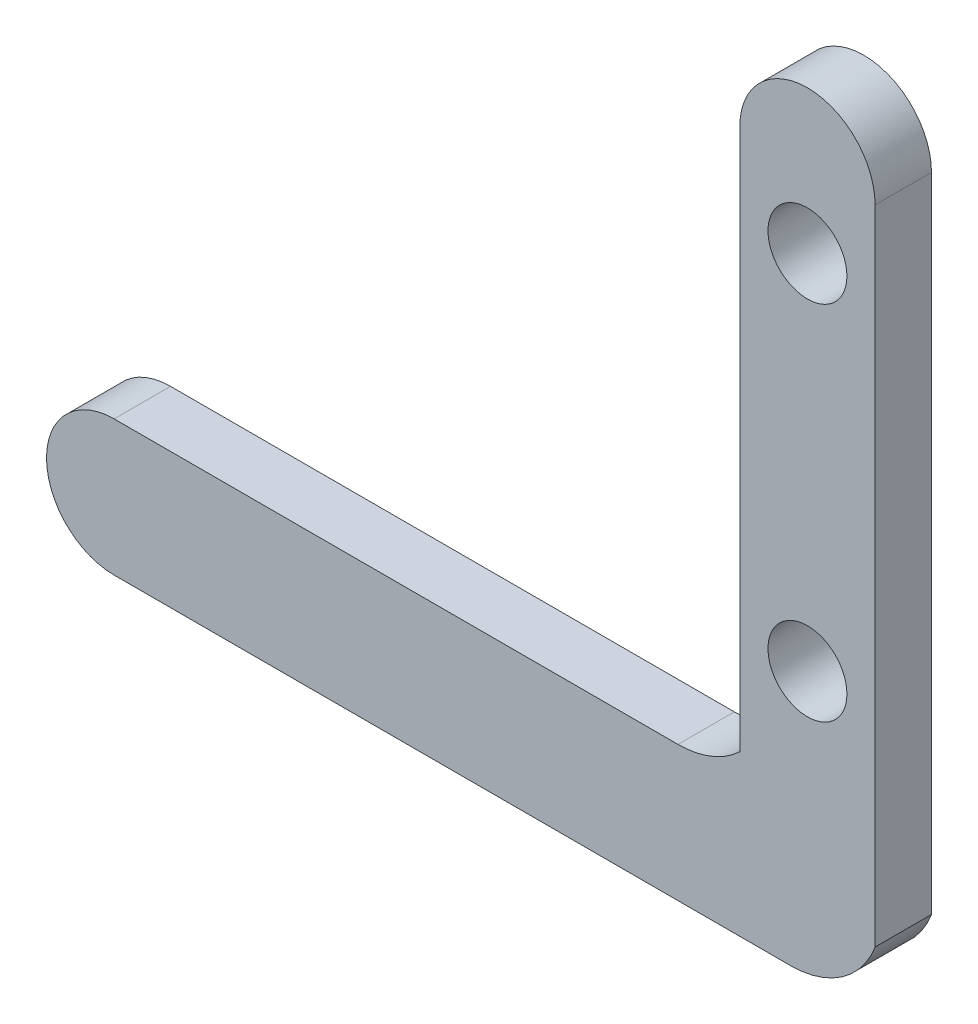
ISO-10303-21;
HEADER;
FILE_DESCRIPTION(('STEP AP214'),'2;1');
FILE_NAME('part.step','',(''),(''),'','','');
FILE_SCHEMA(('AUTOMOTIVE_DESIGN { 1 0 10303 214 1 1 1 1 }'));
ENDSEC;
DATA;
#1=APPLICATION_CONTEXT('core data for automotive mechanical design processes');
#2=APPLICATION_PROTOCOL_DEFINITION('international standard','automotive_design',2000,#1);
#3=PRODUCT_CONTEXT('',#1,'mechanical');
#4=PRODUCT('Part','Part','',(#3));
#5=PRODUCT_RELATED_PRODUCT_CATEGORY('part','',(#4));
#6=PRODUCT_DEFINITION_FORMATION('','',#4);
#7=PRODUCT_DEFINITION_CONTEXT('part definition',#1,'design');
#8=PRODUCT_DEFINITION('design','',#6,#7);
#9=PRODUCT_DEFINITION_SHAPE('','',#8);
#10=(LENGTH_UNIT() NAMED_UNIT(*) SI_UNIT(.MILLI.,.METRE.));
#11=(NAMED_UNIT(*) PLANE_ANGLE_UNIT() SI_UNIT($,.RADIAN.));
#12=(NAMED_UNIT(*) SI_UNIT($,.STERADIAN.) SOLID_ANGLE_UNIT());
#13=UNCERTAINTY_MEASURE_WITH_UNIT(LENGTH_MEASURE(1.E-05),#10,'distance_accuracy_value','');
#14=(GEOMETRIC_REPRESENTATION_CONTEXT(3) GLOBAL_UNCERTAINTY_ASSIGNED_CONTEXT((#13)) GLOBAL_UNIT_ASSIGNED_CONTEXT((#10,
#11,#12)) REPRESENTATION_CONTEXT('',''));
#15=CARTESIAN_POINT('',(0.,0.,0.));
#16=DIRECTION('',(0.,0.,1.));
#17=DIRECTION('',(1.,0.,0.));
#18=AXIS2_PLACEMENT_3D('',#15,#16,#17);
#19=CARTESIAN_POINT('',(-38.4105463641228,6.,5.));
#20=DIRECTION('',(0.,0.,-1.));
#21=DIRECTION('',(-1.,0.,0.));
#22=AXIS2_PLACEMENT_3D('',#19,#20,#21);
#23=CYLINDRICAL_SURFACE('',#22,6.);
#24=CARTESIAN_POINT('',(-38.4105463641228,6.,0.));
#25=DIRECTION('',(0.,0.,1.));
#26=DIRECTION('',(1.,0.,0.));
#27=AXIS2_PLACEMENT_3D('',#24,#25,#26);
#28=CIRCLE('',#27,6.);
#29=CARTESIAN_POINT('',(-38.4105463641228,12.,0.));
#30=VERTEX_POINT('',#29);
#31=CARTESIAN_POINT('',(-38.4105463641228,0.,0.));
#32=VERTEX_POINT('',#31);
#33=EDGE_CURVE('E131',#30,#32,#28,.T.);
#34=ORIENTED_EDGE('',*,*,#33,.T.);
#35=DIRECTION('',(0.,0.,-1.));
#36=VECTOR('',#35,1.);
#37=CARTESIAN_POINT('',(-38.4105463641228,0.,5.));
#38=LINE('',#37,#36);
#39=CARTESIAN_POINT('',(-38.4105463641228,0.,5.));
#40=VERTEX_POINT('',#39);
#41=EDGE_CURVE('E11',#40,#32,#38,.T.);
#42=ORIENTED_EDGE('',*,*,#41,.F.);
#43=CARTESIAN_POINT('',(-38.4105463641228,6.,5.));
#44=DIRECTION('',(0.,0.,1.));
#45=DIRECTION('',(1.,0.,0.));
#46=AXIS2_PLACEMENT_3D('',#43,#44,#45);
#47=CIRCLE('',#46,6.);
#48=CARTESIAN_POINT('',(-38.4105463641228,12.,5.));
#49=VERTEX_POINT('',#48);
#50=EDGE_CURVE('E146',#49,#40,#47,.T.);
#51=ORIENTED_EDGE('',*,*,#50,.F.);
#52=DIRECTION('',(0.,0.,-1.));
#53=VECTOR('',#52,1.);
#54=CARTESIAN_POINT('',(-38.4105463641228,12.,5.));
#55=LINE('',#54,#53);
#56=EDGE_CURVE('E127',#49,#30,#55,.T.);
#57=ORIENTED_EDGE('',*,*,#56,.T.);
#58=EDGE_LOOP('',(#34,#42,#51,#57));
#59=FACE_BOUND('',#58,.T.);
#60=ADVANCED_FACE('F35',(#59),#23,.T.);
#61=CARTESIAN_POINT('',(-38.4105463641228,0.,5.));
#62=DIRECTION('',(0.,1.,0.));
#63=DIRECTION('',(0.,0.,1.));
#64=AXIS2_PLACEMENT_3D('',#61,#62,#63);
#65=PLANE('',#64);
#66=DIRECTION('',(1.,0.,0.));
#67=VECTOR('',#66,1.);
#68=CARTESIAN_POINT('',(-38.4105463641228,0.,0.));
#69=LINE('',#68,#67);
#70=CARTESIAN_POINT('',(21.5894536358772,0.,0.));
#71=VERTEX_POINT('',#70);
#72=EDGE_CURVE('E134',#32,#71,#69,.T.);
#73=ORIENTED_EDGE('',*,*,#72,.T.);
#74=DIRECTION('',(0.,0.,-1.));
#75=VECTOR('',#74,1.);
#76=CARTESIAN_POINT('',(21.5894536358772,0.,5.));
#77=LINE('',#76,#75);
#78=CARTESIAN_POINT('',(21.5894536358772,0.,5.));
#79=VERTEX_POINT('',#78);
#80=EDGE_CURVE('E43',#79,#71,#77,.T.);
#81=ORIENTED_EDGE('',*,*,#80,.F.);
#82=DIRECTION('',(1.,0.,0.));
#83=VECTOR('',#82,1.);
#84=CARTESIAN_POINT('',(-38.4105463641228,0.,5.));
#85=LINE('',#84,#83);
#86=EDGE_CURVE('E94',#40,#79,#85,.T.);
#87=ORIENTED_EDGE('',*,*,#86,.F.);
#88=ORIENTED_EDGE('',*,*,#41,.T.);
#89=EDGE_LOOP('',(#73,#81,#87,#88));
#90=FACE_BOUND('',#89,.T.);
#91=ADVANCED_FACE('F215',(#90),#65,.F.);
#92=CARTESIAN_POINT('',(21.5894536358772,8.,5.));
#93=DIRECTION('',(0.,0.,-1.));
#94=DIRECTION('',(-1.,0.,0.));
#95=AXIS2_PLACEMENT_3D('',#92,#93,#94);
#96=CYLINDRICAL_SURFACE('',#95,8.);
#97=CARTESIAN_POINT('',(21.5894536358772,8.,0.));
#98=DIRECTION('',(0.,0.,1.));
#99=DIRECTION('',(1.,0.,0.));
#100=AXIS2_PLACEMENT_3D('',#97,#98,#99);
#101=CIRCLE('',#100,8.);
#102=CARTESIAN_POINT('',(29.0746438649833,5.17653984726262,0.));
#103=VERTEX_POINT('',#102);
#104=EDGE_CURVE('E137',#71,#103,#101,.T.);
#105=ORIENTED_EDGE('',*,*,#104,.T.);
#106=DIRECTION('',(0.,0.,-1.));
#107=VECTOR('',#106,1.);
#108=CARTESIAN_POINT('',(29.0746438649833,5.17653984726262,5.));
#109=LINE('',#108,#107);
#110=CARTESIAN_POINT('',(29.0746438649833,5.17653984726262,5.));
#111=VERTEX_POINT('',#110);
#112=EDGE_CURVE('E153',#111,#103,#109,.T.);
#113=ORIENTED_EDGE('',*,*,#112,.F.);
#114=CARTESIAN_POINT('',(21.5894536358772,8.,5.));
#115=DIRECTION('',(0.,0.,1.));
#116=DIRECTION('',(1.,0.,0.));
#117=AXIS2_PLACEMENT_3D('',#114,#115,#116);
#118=CIRCLE('',#117,8.);
#119=EDGE_CURVE('E161',#79,#111,#118,.T.);
#120=ORIENTED_EDGE('',*,*,#119,.F.);
#121=ORIENTED_EDGE('',*,*,#80,.T.);
#122=EDGE_LOOP('',(#105,#113,#120,#121));
#123=FACE_BOUND('',#122,.T.);
#124=ADVANCED_FACE('F159',(#123),#96,.T.);
#125=CARTESIAN_POINT('',(29.0746438649832,62.1765398472626,5.));
#126=DIRECTION('',(-1.,0.,0.));
#127=DIRECTION('',(0.,-1.,0.));
#128=AXIS2_PLACEMENT_3D('',#125,#126,#127);
#129=PLANE('',#128);
#130=DIRECTION('',(0.,1.,0.));
#131=VECTOR('',#130,1.);
#132=CARTESIAN_POINT('',(29.0746438649832,62.1765398472626,0.));
#133=LINE('',#132,#131);
#134=CARTESIAN_POINT('',(29.0746438649832,62.1765398472626,0.));
#135=VERTEX_POINT('',#134);
#136=EDGE_CURVE('E139',#103,#135,#133,.T.);
#137=ORIENTED_EDGE('',*,*,#136,.T.);
#138=DIRECTION('',(0.,0.,-1.));
#139=VECTOR('',#138,1.);
#140=CARTESIAN_POINT('',(29.0746438649832,62.1765398472626,5.));
#141=LINE('',#140,#139);
#142=CARTESIAN_POINT('',(29.0746438649832,62.1765398472626,5.));
#143=VERTEX_POINT('',#142);
#144=EDGE_CURVE('E150',#143,#135,#141,.T.);
#145=ORIENTED_EDGE('',*,*,#144,.F.);
#146=DIRECTION('',(0.,1.,0.));
#147=VECTOR('',#146,1.);
#148=CARTESIAN_POINT('',(29.0746438649832,62.1765398472626,5.));
#149=LINE('',#148,#147);
#150=EDGE_CURVE('E173',#111,#143,#149,.T.);
#151=ORIENTED_EDGE('',*,*,#150,.F.);
#152=ORIENTED_EDGE('',*,*,#112,.T.);
#153=EDGE_LOOP('',(#137,#145,#151,#152));
#154=FACE_BOUND('',#153,.T.);
#155=ADVANCED_FACE('F169',(#154),#129,.F.);
#156=CARTESIAN_POINT('',(23.0746438649832,62.1765398472626,5.));
#157=DIRECTION('',(0.,0.,-1.));
#158=DIRECTION('',(-1.,0.,0.));
#159=AXIS2_PLACEMENT_3D('',#156,#157,#158);
#160=CYLINDRICAL_SURFACE('',#159,6.00000000000001);
#161=CARTESIAN_POINT('',(23.0746438649832,62.1765398472626,0.));
#162=DIRECTION('',(0.,0.,1.));
#163=DIRECTION('',(-1.,0.,0.));
#164=AXIS2_PLACEMENT_3D('',#161,#162,#163);
#165=CIRCLE('',#164,6.00000000000001);
#166=CARTESIAN_POINT('',(17.0746438649832,62.1765398472626,0.));
#167=VERTEX_POINT('',#166);
#168=EDGE_CURVE('E141',#135,#167,#165,.T.);
#169=ORIENTED_EDGE('',*,*,#168,.T.);
#170=DIRECTION('',(0.,0.,-1.));
#171=VECTOR('',#170,1.);
#172=CARTESIAN_POINT('',(17.0746438649832,62.1765398472626,5.));
#173=LINE('',#172,#171);
#174=CARTESIAN_POINT('',(17.0746438649832,62.1765398472626,5.));
#175=VERTEX_POINT('',#174);
#176=EDGE_CURVE('E122',#175,#167,#173,.T.);
#177=ORIENTED_EDGE('',*,*,#176,.F.);
#178=CARTESIAN_POINT('',(23.0746438649832,62.1765398472626,5.));
#179=DIRECTION('',(0.,0.,1.));
#180=DIRECTION('',(-1.,0.,0.));
#181=AXIS2_PLACEMENT_3D('',#178,#179,#180);
#182=CIRCLE('',#181,6.00000000000001);
#183=EDGE_CURVE('E113',#143,#175,#182,.T.);
#184=ORIENTED_EDGE('',*,*,#183,.F.);
#185=ORIENTED_EDGE('',*,*,#144,.T.);
#186=EDGE_LOOP('',(#169,#177,#184,#185));
#187=FACE_BOUND('',#186,.T.);
#188=ADVANCED_FACE('F172',(#187),#160,.T.);
#189=CARTESIAN_POINT('',(17.0746438649832,62.1765398472626,5.));
#190=DIRECTION('',(1.,0.,0.));
#191=DIRECTION('',(0.,1.,0.));
#192=AXIS2_PLACEMENT_3D('',#189,#190,#191);
#193=PLANE('',#192);
#194=DIRECTION('',(0.,-1.,0.));
#195=VECTOR('',#194,1.);
#196=CARTESIAN_POINT('',(17.0746438649832,62.1765398472626,0.));
#197=LINE('',#196,#195);
#198=CARTESIAN_POINT('',(17.0746438649833,14.1765398472626,0.));
#199=VERTEX_POINT('',#198);
#200=EDGE_CURVE('E121',#167,#199,#197,.T.);
#201=ORIENTED_EDGE('',*,*,#200,.T.);
#202=DIRECTION('',(0.,0.,-1.));
#203=VECTOR('',#202,1.);
#204=CARTESIAN_POINT('',(17.0746438649833,14.1765398472626,5.));
#205=LINE('',#204,#203);
#206=CARTESIAN_POINT('',(17.0746438649833,14.1765398472626,5.));
#207=VERTEX_POINT('',#206);
#208=EDGE_CURVE('E118',#207,#199,#205,.T.);
#209=ORIENTED_EDGE('',*,*,#208,.F.);
#210=DIRECTION('',(0.,-1.,0.));
#211=VECTOR('',#210,1.);
#212=CARTESIAN_POINT('',(17.0746438649832,62.1765398472626,5.));
#213=LINE('',#212,#211);
#214=EDGE_CURVE('E107',#175,#207,#213,.T.);
#215=ORIENTED_EDGE('',*,*,#214,.F.);
#216=ORIENTED_EDGE('',*,*,#176,.T.);
#217=EDGE_LOOP('',(#201,#209,#215,#216));
#218=FACE_BOUND('',#217,.T.);
#219=ADVANCED_FACE('F119',(#218),#193,.F.);
#220=CARTESIAN_POINT('',(11.5894536358772,20.,5.));
#221=DIRECTION('',(0.,0.,-1.));
#222=DIRECTION('',(-1.,0.,0.));
#223=AXIS2_PLACEMENT_3D('',#220,#221,#222);
#224=CYLINDRICAL_SURFACE('',#223,8.);
#225=CARTESIAN_POINT('',(11.5894536358772,20.,0.));
#226=DIRECTION('',(0.,0.,-1.));
#227=DIRECTION('',(1.,0.,0.));
#228=AXIS2_PLACEMENT_3D('',#225,#226,#227);
#229=CIRCLE('',#228,8.);
#230=CARTESIAN_POINT('',(11.5894536358772,12.,0.));
#231=VERTEX_POINT('',#230);
#232=EDGE_CURVE('E80',#199,#231,#229,.T.);
#233=ORIENTED_EDGE('',*,*,#232,.T.);
#234=DIRECTION('',(0.,0.,-1.));
#235=VECTOR('',#234,1.);
#236=CARTESIAN_POINT('',(11.5894536358772,12.,5.));
#237=LINE('',#236,#235);
#238=CARTESIAN_POINT('',(11.5894536358772,12.,5.));
#239=VERTEX_POINT('',#238);
#240=EDGE_CURVE('E123',#239,#231,#237,.T.);
#241=ORIENTED_EDGE('',*,*,#240,.F.);
#242=CARTESIAN_POINT('',(11.5894536358772,20.,5.));
#243=DIRECTION('',(0.,0.,-1.));
#244=DIRECTION('',(1.,0.,0.));
#245=AXIS2_PLACEMENT_3D('',#242,#243,#244);
#246=CIRCLE('',#245,8.);
#247=EDGE_CURVE('E111',#207,#239,#246,.T.);
#248=ORIENTED_EDGE('',*,*,#247,.F.);
#249=ORIENTED_EDGE('',*,*,#208,.T.);
#250=EDGE_LOOP('',(#233,#241,#248,#249));
#251=FACE_BOUND('',#250,.T.);
#252=ADVANCED_FACE('F125',(#251),#224,.F.);
#253=CARTESIAN_POINT('',(-38.4105463641228,12.,5.));
#254=DIRECTION('',(0.,-1.,0.));
#255=DIRECTION('',(1.,0.,0.));
#256=AXIS2_PLACEMENT_3D('',#253,#254,#255);
#257=PLANE('',#256);
#258=DIRECTION('',(-1.,0.,0.));
#259=VECTOR('',#258,1.);
#260=CARTESIAN_POINT('',(-38.4105463641228,12.,0.));
#261=LINE('',#260,#259);
#262=EDGE_CURVE('E86',#231,#30,#261,.T.);
#263=ORIENTED_EDGE('',*,*,#262,.T.);
#264=ORIENTED_EDGE('',*,*,#56,.F.);
#265=DIRECTION('',(-1.,0.,0.));
#266=VECTOR('',#265,1.);
#267=CARTESIAN_POINT('',(-38.4105463641228,12.,5.));
#268=LINE('',#267,#266);
#269=EDGE_CURVE('E51',#239,#49,#268,.T.);
#270=ORIENTED_EDGE('',*,*,#269,.F.);
#271=ORIENTED_EDGE('',*,*,#240,.T.);
#272=EDGE_LOOP('',(#263,#264,#270,#271));
#273=FACE_BOUND('',#272,.T.);
#274=ADVANCED_FACE('F202',(#273),#257,.F.);
#275=CARTESIAN_POINT('',(-38.4105463641228,6.,5.));
#276=DIRECTION('',(0.,0.,1.));
#277=DIRECTION('',(1.,0.,0.));
#278=AXIS2_PLACEMENT_3D('',#275,#276,#277);
#279=PLANE('',#278);
#280=CARTESIAN_POINT('',(23.0746438649833,23.3599012876908,5.));
#281=DIRECTION('',(0.,0.,1.));
#282=DIRECTION('',(1.,0.,0.));
#283=AXIS2_PLACEMENT_3D('',#280,#281,#282);
#284=CIRCLE('',#283,3.5);
#285=CARTESIAN_POINT('',(26.5746438649833,23.3599012876908,5.));
#286=VERTEX_POINT('',#285);
#287=EDGE_CURVE('E185',#286,#286,#284,.T.);
#288=ORIENTED_EDGE('',*,*,#287,.F.);
#289=EDGE_LOOP('',(#288));
#290=FACE_BOUND('',#289,.T.);
#291=CARTESIAN_POINT('',(23.0746438649832,55.4510079069956,5.));
#292=DIRECTION('',(0.,0.,1.));
#293=DIRECTION('',(1.,0.,0.));
#294=AXIS2_PLACEMENT_3D('',#291,#292,#293);
#295=CIRCLE('',#294,3.5);
#296=CARTESIAN_POINT('',(26.5746438649832,55.4510079069956,5.));
#297=VERTEX_POINT('',#296);
#298=EDGE_CURVE('E179',#297,#297,#295,.T.);
#299=ORIENTED_EDGE('',*,*,#298,.F.);
#300=EDGE_LOOP('',(#299));
#301=FACE_BOUND('',#300,.T.);
#302=ORIENTED_EDGE('',*,*,#50,.T.);
#303=ORIENTED_EDGE('',*,*,#86,.T.);
#304=ORIENTED_EDGE('',*,*,#119,.T.);
#305=ORIENTED_EDGE('',*,*,#150,.T.);
#306=ORIENTED_EDGE('',*,*,#183,.T.);
#307=ORIENTED_EDGE('',*,*,#214,.T.);
#308=ORIENTED_EDGE('',*,*,#247,.T.);
#309=ORIENTED_EDGE('',*,*,#269,.T.);
#310=EDGE_LOOP('',(#302,#303,#304,#305,#306,#307,#308,#309));
#311=FACE_BOUND('',#310,.T.);
#312=ADVANCED_FACE('F109',(#290,#301,#311),#279,.T.);
#313=CARTESIAN_POINT('',(-38.4105463641228,6.,0.));
#314=DIRECTION('',(0.,0.,1.));
#315=DIRECTION('',(1.,0.,0.));
#316=AXIS2_PLACEMENT_3D('',#313,#314,#315);
#317=PLANE('',#316);
#318=CARTESIAN_POINT('',(23.0746438649833,23.3599012876908,0.));
#319=DIRECTION('',(0.,0.,1.));
#320=DIRECTION('',(1.,0.,0.));
#321=AXIS2_PLACEMENT_3D('',#318,#319,#320);
#322=CIRCLE('',#321,3.5);
#323=CARTESIAN_POINT('',(26.5746438649833,23.3599012876908,0.));
#324=VERTEX_POINT('',#323);
#325=EDGE_CURVE('E182',#324,#324,#322,.T.);
#326=ORIENTED_EDGE('',*,*,#325,.T.);
#327=EDGE_LOOP('',(#326));
#328=FACE_BOUND('',#327,.T.);
#329=CARTESIAN_POINT('',(23.0746438649832,55.4510079069956,0.));
#330=DIRECTION('',(0.,0.,1.));
#331=DIRECTION('',(1.,0.,0.));
#332=AXIS2_PLACEMENT_3D('',#329,#330,#331);
#333=CIRCLE('',#332,3.5);
#334=CARTESIAN_POINT('',(26.5746438649832,55.4510079069956,0.));
#335=VERTEX_POINT('',#334);
#336=EDGE_CURVE('E135',#335,#335,#333,.T.);
#337=ORIENTED_EDGE('',*,*,#336,.T.);
#338=EDGE_LOOP('',(#337));
#339=FACE_BOUND('',#338,.T.);
#340=ORIENTED_EDGE('',*,*,#33,.F.);
#341=ORIENTED_EDGE('',*,*,#262,.F.);
#342=ORIENTED_EDGE('',*,*,#232,.F.);
#343=ORIENTED_EDGE('',*,*,#200,.F.);
#344=ORIENTED_EDGE('',*,*,#168,.F.);
#345=ORIENTED_EDGE('',*,*,#136,.F.);
#346=ORIENTED_EDGE('',*,*,#104,.F.);
#347=ORIENTED_EDGE('',*,*,#72,.F.);
#348=EDGE_LOOP('',(#340,#341,#342,#343,#344,#345,#346,#347));
#349=FACE_BOUND('',#348,.T.);
#350=ADVANCED_FACE('F165',(#328,#339,#349),#317,.F.);
#351=CARTESIAN_POINT('',(23.0746438649832,55.4510079069956,0.));
#352=DIRECTION('',(0.,0.,1.));
#353=DIRECTION('',(1.,0.,0.));
#354=AXIS2_PLACEMENT_3D('',#351,#352,#353);
#355=CYLINDRICAL_SURFACE('',#354,3.5);
#356=ORIENTED_EDGE('',*,*,#336,.F.);
#357=EDGE_LOOP('',(#356));
#358=FACE_BOUND('',#357,.T.);
#359=ORIENTED_EDGE('',*,*,#298,.T.);
#360=EDGE_LOOP('',(#359));
#361=FACE_BOUND('',#360,.T.);
#362=ADVANCED_FACE('F196',(#358,#361),#355,.F.);
#363=CARTESIAN_POINT('',(23.0746438649833,23.3599012876908,0.));
#364=DIRECTION('',(0.,0.,1.));
#365=DIRECTION('',(1.,0.,0.));
#366=AXIS2_PLACEMENT_3D('',#363,#364,#365);
#367=CYLINDRICAL_SURFACE('',#366,3.5);
#368=ORIENTED_EDGE('',*,*,#325,.F.);
#369=EDGE_LOOP('',(#368));
#370=FACE_BOUND('',#369,.T.);
#371=ORIENTED_EDGE('',*,*,#287,.T.);
#372=EDGE_LOOP('',(#371));
#373=FACE_BOUND('',#372,.T.);
#374=ADVANCED_FACE('F193',(#370,#373),#367,.F.);
#375=CLOSED_SHELL('',(#60,#91,#124,#155,#188,#219,#252,#274,#312,#350,#362,#374));
#376=MANIFOLD_SOLID_BREP('B2',#375);
#377=ADVANCED_BREP_SHAPE_REPRESENTATION('',(#18,#376),#14);
#378=SHAPE_DEFINITION_REPRESENTATION(#9,#377);
ENDSEC;
END-ISO-10303-21;
